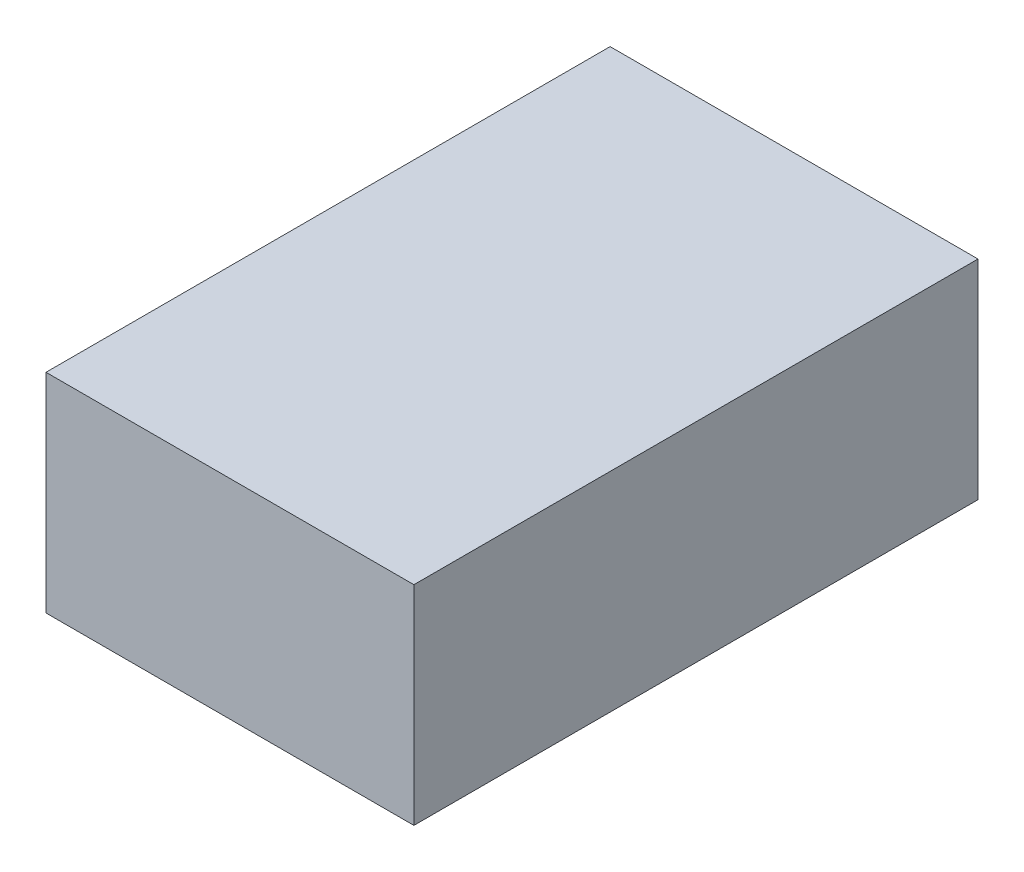
ISO-10303-21;
HEADER;
FILE_DESCRIPTION(('STEP AP214'),'2;1');
FILE_NAME('part.step','',(''),(''),'','','');
FILE_SCHEMA(('AUTOMOTIVE_DESIGN { 1 0 10303 214 1 1 1 1 }'));
ENDSEC;
DATA;
#1=APPLICATION_CONTEXT('core data for automotive mechanical design processes');
#2=APPLICATION_PROTOCOL_DEFINITION('international standard','automotive_design',2000,#1);
#3=PRODUCT_CONTEXT('',#1,'mechanical');
#4=PRODUCT('Part','Part','',(#3));
#5=PRODUCT_RELATED_PRODUCT_CATEGORY('part','',(#4));
#6=PRODUCT_DEFINITION_FORMATION('','',#4);
#7=PRODUCT_DEFINITION_CONTEXT('part definition',#1,'design');
#8=PRODUCT_DEFINITION('design','',#6,#7);
#9=PRODUCT_DEFINITION_SHAPE('','',#8);
#10=(LENGTH_UNIT() NAMED_UNIT(*) SI_UNIT(.MILLI.,.METRE.));
#11=(NAMED_UNIT(*) PLANE_ANGLE_UNIT() SI_UNIT($,.RADIAN.));
#12=(NAMED_UNIT(*) SI_UNIT($,.STERADIAN.) SOLID_ANGLE_UNIT());
#13=UNCERTAINTY_MEASURE_WITH_UNIT(LENGTH_MEASURE(1.E-05),#10,'distance_accuracy_value','');
#14=(GEOMETRIC_REPRESENTATION_CONTEXT(3) GLOBAL_UNCERTAINTY_ASSIGNED_CONTEXT((#13)) GLOBAL_UNIT_ASSIGNED_CONTEXT((#10,
#11,#12)) REPRESENTATION_CONTEXT('',''));
#15=CARTESIAN_POINT('',(0.,0.,0.));
#16=DIRECTION('',(0.,0.,1.));
#17=DIRECTION('',(1.,0.,0.));
#18=AXIS2_PLACEMENT_3D('',#15,#16,#17);
#19=CARTESIAN_POINT('',(-1532.25352112676,170.,-1431.83098591549));
#20=DIRECTION('',(1.,0.,0.));
#21=DIRECTION('',(0.,0.,-1.));
#22=AXIS2_PLACEMENT_3D('',#19,#20,#21);
#23=PLANE('',#22);
#24=DIRECTION('',(0.,0.,1.));
#25=VECTOR('',#24,1.);
#26=CARTESIAN_POINT('',(-1532.25352112676,0.,-1431.83098591549));
#27=LINE('',#26,#25);
#28=CARTESIAN_POINT('',(-1532.25352112676,0.,-1431.83098591549));
#29=VERTEX_POINT('',#28);
#30=CARTESIAN_POINT('',(-1532.25352112676,0.,-971.830985915493));
#31=VERTEX_POINT('',#30);
#32=EDGE_CURVE('E113',#29,#31,#27,.T.);
#33=ORIENTED_EDGE('',*,*,#32,.T.);
#34=DIRECTION('',(0.,-1.,0.));
#35=VECTOR('',#34,1.);
#36=CARTESIAN_POINT('',(-1532.25352112676,170.,-971.830985915493));
#37=LINE('',#36,#35);
#38=CARTESIAN_POINT('',(-1532.25352112676,170.,-971.830985915493));
#39=VERTEX_POINT('',#38);
#40=EDGE_CURVE('E11',#39,#31,#37,.T.);
#41=ORIENTED_EDGE('',*,*,#40,.F.);
#42=DIRECTION('',(0.,0.,1.));
#43=VECTOR('',#42,1.);
#44=CARTESIAN_POINT('',(-1532.25352112676,170.,-1431.83098591549));
#45=LINE('',#44,#43);
#46=CARTESIAN_POINT('',(-1532.25352112676,170.,-1431.83098591549));
#47=VERTEX_POINT('',#46);
#48=EDGE_CURVE('E97',#47,#39,#45,.T.);
#49=ORIENTED_EDGE('',*,*,#48,.F.);
#50=DIRECTION('',(0.,-1.,0.));
#51=VECTOR('',#50,1.);
#52=CARTESIAN_POINT('',(-1532.25352112676,170.,-1431.83098591549));
#53=LINE('',#52,#51);
#54=EDGE_CURVE('E109',#47,#29,#53,.T.);
#55=ORIENTED_EDGE('',*,*,#54,.T.);
#56=EDGE_LOOP('',(#33,#41,#49,#55));
#57=FACE_BOUND('',#56,.T.);
#58=ADVANCED_FACE('F45',(#57),#23,.F.);
#59=CARTESIAN_POINT('',(-1532.25352112676,170.,-971.830985915493));
#60=DIRECTION('',(0.,0.,-1.));
#61=DIRECTION('',(-1.,0.,0.));
#62=AXIS2_PLACEMENT_3D('',#59,#60,#61);
#63=PLANE('',#62);
#64=DIRECTION('',(1.,0.,0.));
#65=VECTOR('',#64,1.);
#66=CARTESIAN_POINT('',(-1532.25352112676,0.,-971.830985915493));
#67=LINE('',#66,#65);
#68=CARTESIAN_POINT('',(-1232.25352112676,0.,-971.830985915493));
#69=VERTEX_POINT('',#68);
#70=EDGE_CURVE('E102',#31,#69,#67,.T.);
#71=ORIENTED_EDGE('',*,*,#70,.T.);
#72=DIRECTION('',(0.,-1.,0.));
#73=VECTOR('',#72,1.);
#74=CARTESIAN_POINT('',(-1232.25352112676,170.,-971.830985915493));
#75=LINE('',#74,#73);
#76=CARTESIAN_POINT('',(-1232.25352112676,170.,-971.830985915493));
#77=VERTEX_POINT('',#76);
#78=EDGE_CURVE('E54',#77,#69,#75,.T.);
#79=ORIENTED_EDGE('',*,*,#78,.F.);
#80=DIRECTION('',(1.,0.,0.));
#81=VECTOR('',#80,1.);
#82=CARTESIAN_POINT('',(-1532.25352112676,170.,-971.830985915493));
#83=LINE('',#82,#81);
#84=EDGE_CURVE('E92',#39,#77,#83,.T.);
#85=ORIENTED_EDGE('',*,*,#84,.F.);
#86=ORIENTED_EDGE('',*,*,#40,.T.);
#87=EDGE_LOOP('',(#71,#79,#85,#86));
#88=FACE_BOUND('',#87,.T.);
#89=ADVANCED_FACE('F101',(#88),#63,.F.);
#90=CARTESIAN_POINT('',(-1232.25352112676,170.,-1431.83098591549));
#91=DIRECTION('',(-1.,0.,0.));
#92=DIRECTION('',(0.,0.,1.));
#93=AXIS2_PLACEMENT_3D('',#90,#91,#92);
#94=PLANE('',#93);
#95=DIRECTION('',(0.,0.,-1.));
#96=VECTOR('',#95,1.);
#97=CARTESIAN_POINT('',(-1232.25352112676,0.,-1431.83098591549));
#98=LINE('',#97,#96);
#99=CARTESIAN_POINT('',(-1232.25352112676,0.,-1431.83098591549));
#100=VERTEX_POINT('',#99);
#101=EDGE_CURVE('E79',#69,#100,#98,.T.);
#102=ORIENTED_EDGE('',*,*,#101,.T.);
#103=DIRECTION('',(0.,-1.,0.));
#104=VECTOR('',#103,1.);
#105=CARTESIAN_POINT('',(-1232.25352112676,170.,-1431.83098591549));
#106=LINE('',#105,#104);
#107=CARTESIAN_POINT('',(-1232.25352112676,170.,-1431.83098591549));
#108=VERTEX_POINT('',#107);
#109=EDGE_CURVE('E104',#108,#100,#106,.T.);
#110=ORIENTED_EDGE('',*,*,#109,.F.);
#111=DIRECTION('',(0.,0.,-1.));
#112=VECTOR('',#111,1.);
#113=CARTESIAN_POINT('',(-1232.25352112676,170.,-1431.83098591549));
#114=LINE('',#113,#112);
#115=EDGE_CURVE('E95',#77,#108,#114,.T.);
#116=ORIENTED_EDGE('',*,*,#115,.F.);
#117=ORIENTED_EDGE('',*,*,#78,.T.);
#118=EDGE_LOOP('',(#102,#110,#116,#117));
#119=FACE_BOUND('',#118,.T.);
#120=ADVANCED_FACE('F105',(#119),#94,.F.);
#121=CARTESIAN_POINT('',(-1532.25352112676,170.,-1431.83098591549));
#122=DIRECTION('',(0.,0.,1.));
#123=DIRECTION('',(1.,0.,0.));
#124=AXIS2_PLACEMENT_3D('',#121,#122,#123);
#125=PLANE('',#124);
#126=DIRECTION('',(-1.,0.,0.));
#127=VECTOR('',#126,1.);
#128=CARTESIAN_POINT('',(-1532.25352112676,0.,-1431.83098591549));
#129=LINE('',#128,#127);
#130=EDGE_CURVE('E85',#100,#29,#129,.T.);
#131=ORIENTED_EDGE('',*,*,#130,.T.);
#132=ORIENTED_EDGE('',*,*,#54,.F.);
#133=DIRECTION('',(-1.,0.,0.));
#134=VECTOR('',#133,1.);
#135=CARTESIAN_POINT('',(-1532.25352112676,170.,-1431.83098591549));
#136=LINE('',#135,#134);
#137=EDGE_CURVE('E62',#108,#47,#136,.T.);
#138=ORIENTED_EDGE('',*,*,#137,.F.);
#139=ORIENTED_EDGE('',*,*,#109,.T.);
#140=EDGE_LOOP('',(#131,#132,#138,#139));
#141=FACE_BOUND('',#140,.T.);
#142=ADVANCED_FACE('F126',(#141),#125,.F.);
#143=CARTESIAN_POINT('',(0.,170.,0.));
#144=DIRECTION('',(0.,1.,0.));
#145=DIRECTION('',(0.,0.,1.));
#146=AXIS2_PLACEMENT_3D('',#143,#144,#145);
#147=PLANE('',#146);
#148=ORIENTED_EDGE('',*,*,#48,.T.);
#149=ORIENTED_EDGE('',*,*,#84,.T.);
#150=ORIENTED_EDGE('',*,*,#115,.T.);
#151=ORIENTED_EDGE('',*,*,#137,.T.);
#152=EDGE_LOOP('',(#148,#149,#150,#151));
#153=FACE_BOUND('',#152,.T.);
#154=ADVANCED_FACE('F93',(#153),#147,.T.);
#155=CARTESIAN_POINT('',(0.,0.,0.));
#156=DIRECTION('',(0.,1.,0.));
#157=DIRECTION('',(0.,0.,1.));
#158=AXIS2_PLACEMENT_3D('',#155,#156,#157);
#159=PLANE('',#158);
#160=ORIENTED_EDGE('',*,*,#32,.F.);
#161=ORIENTED_EDGE('',*,*,#130,.F.);
#162=ORIENTED_EDGE('',*,*,#101,.F.);
#163=ORIENTED_EDGE('',*,*,#70,.F.);
#164=EDGE_LOOP('',(#160,#161,#162,#163));
#165=FACE_BOUND('',#164,.T.);
#166=ADVANCED_FACE('F129',(#165),#159,.F.);
#167=CLOSED_SHELL('',(#58,#89,#120,#142,#154,#166));
#168=MANIFOLD_SOLID_BREP('B2',#167);
#169=ADVANCED_BREP_SHAPE_REPRESENTATION('',(#18,#168),#14);
#170=SHAPE_DEFINITION_REPRESENTATION(#9,#169);
ENDSEC;
END-ISO-10303-21;
